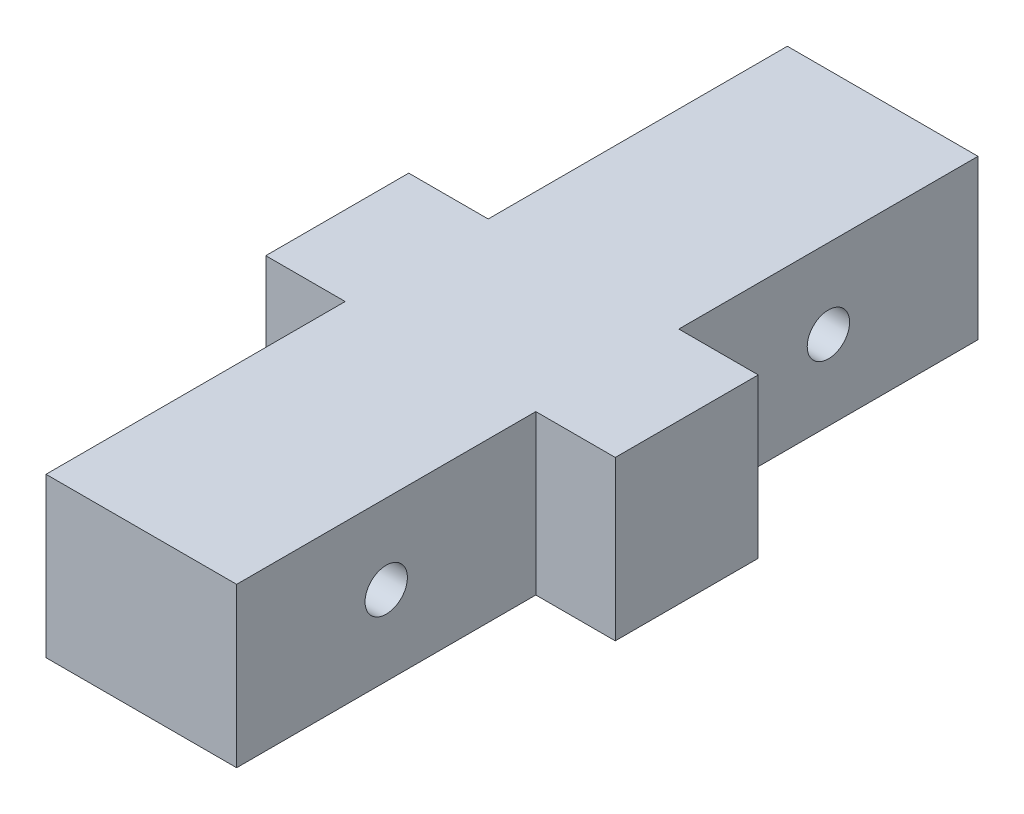
ISO-10303-21;
HEADER;
FILE_DESCRIPTION(('STEP AP214'),'2;1');
FILE_NAME('part.step','',(''),(''),'','','');
FILE_SCHEMA(('AUTOMOTIVE_DESIGN { 1 0 10303 214 1 1 1 1 }'));
ENDSEC;
DATA;
#1=APPLICATION_CONTEXT('core data for automotive mechanical design processes');
#2=APPLICATION_PROTOCOL_DEFINITION('international standard','automotive_design',2000,#1);
#3=PRODUCT_CONTEXT('',#1,'mechanical');
#4=PRODUCT('Part','Part','',(#3));
#5=PRODUCT_RELATED_PRODUCT_CATEGORY('part','',(#4));
#6=PRODUCT_DEFINITION_FORMATION('','',#4);
#7=PRODUCT_DEFINITION_CONTEXT('part definition',#1,'design');
#8=PRODUCT_DEFINITION('design','',#6,#7);
#9=PRODUCT_DEFINITION_SHAPE('','',#8);
#10=(LENGTH_UNIT() NAMED_UNIT(*) SI_UNIT(.MILLI.,.METRE.));
#11=(NAMED_UNIT(*) PLANE_ANGLE_UNIT() SI_UNIT($,.RADIAN.));
#12=(NAMED_UNIT(*) SI_UNIT($,.STERADIAN.) SOLID_ANGLE_UNIT());
#13=UNCERTAINTY_MEASURE_WITH_UNIT(LENGTH_MEASURE(1.E-05),#10,'distance_accuracy_value','');
#14=(GEOMETRIC_REPRESENTATION_CONTEXT(3) GLOBAL_UNCERTAINTY_ASSIGNED_CONTEXT((#13)) GLOBAL_UNIT_ASSIGNED_CONTEXT((#10,
#11,#12)) REPRESENTATION_CONTEXT('',''));
#15=CARTESIAN_POINT('',(0.,0.,0.));
#16=DIRECTION('',(0.,0.,1.));
#17=DIRECTION('',(1.,0.,0.));
#18=AXIS2_PLACEMENT_3D('',#15,#16,#17);
#19=CARTESIAN_POINT('',(-66.,60.,-27.));
#20=DIRECTION('',(1.,0.,0.));
#21=DIRECTION('',(0.,0.,-1.));
#22=AXIS2_PLACEMENT_3D('',#19,#20,#21);
#23=PLANE('',#22);
#24=DIRECTION('',(0.,0.,1.));
#25=VECTOR('',#24,1.);
#26=CARTESIAN_POINT('',(-66.,0.,-27.));
#27=LINE('',#26,#25);
#28=CARTESIAN_POINT('',(-66.,0.,-27.));
#29=VERTEX_POINT('',#28);
#30=CARTESIAN_POINT('',(-65.9999999999999,0.,27.));
#31=VERTEX_POINT('',#30);
#32=EDGE_CURVE('E156',#29,#31,#27,.T.);
#33=ORIENTED_EDGE('',*,*,#32,.T.);
#34=DIRECTION('',(0.,-1.,0.));
#35=VECTOR('',#34,1.);
#36=CARTESIAN_POINT('',(-65.9999999999999,60.,27.));
#37=LINE('',#36,#35);
#38=CARTESIAN_POINT('',(-65.9999999999999,60.,27.));
#39=VERTEX_POINT('',#38);
#40=EDGE_CURVE('E11',#39,#31,#37,.T.);
#41=ORIENTED_EDGE('',*,*,#40,.F.);
#42=DIRECTION('',(0.,0.,1.));
#43=VECTOR('',#42,1.);
#44=CARTESIAN_POINT('',(-66.,60.,-27.));
#45=LINE('',#44,#43);
#46=CARTESIAN_POINT('',(-66.,60.,-27.));
#47=VERTEX_POINT('',#46);
#48=EDGE_CURVE('E179',#47,#39,#45,.T.);
#49=ORIENTED_EDGE('',*,*,#48,.F.);
#50=DIRECTION('',(0.,-1.,0.));
#51=VECTOR('',#50,1.);
#52=CARTESIAN_POINT('',(-66.,60.,-27.));
#53=LINE('',#52,#51);
#54=EDGE_CURVE('E152',#47,#29,#53,.T.);
#55=ORIENTED_EDGE('',*,*,#54,.T.);
#56=EDGE_LOOP('',(#33,#41,#49,#55));
#57=FACE_BOUND('',#56,.T.);
#58=ADVANCED_FACE('F34',(#57),#23,.F.);
#59=CARTESIAN_POINT('',(-36.,60.,27.));
#60=DIRECTION('',(0.,0.,-1.));
#61=DIRECTION('',(-1.,0.,0.));
#62=AXIS2_PLACEMENT_3D('',#59,#60,#61);
#63=PLANE('',#62);
#64=DIRECTION('',(1.,0.,0.));
#65=VECTOR('',#64,1.);
#66=CARTESIAN_POINT('',(-36.,0.,27.));
#67=LINE('',#66,#65);
#68=CARTESIAN_POINT('',(-36.,0.,27.));
#69=VERTEX_POINT('',#68);
#70=EDGE_CURVE('E159',#31,#69,#67,.T.);
#71=ORIENTED_EDGE('',*,*,#70,.T.);
#72=DIRECTION('',(0.,-1.,0.));
#73=VECTOR('',#72,1.);
#74=CARTESIAN_POINT('',(-36.,60.,27.));
#75=LINE('',#74,#73);
#76=CARTESIAN_POINT('',(-36.,60.,27.));
#77=VERTEX_POINT('',#76);
#78=EDGE_CURVE('E43',#77,#69,#75,.T.);
#79=ORIENTED_EDGE('',*,*,#78,.F.);
#80=DIRECTION('',(1.,0.,0.));
#81=VECTOR('',#80,1.);
#82=CARTESIAN_POINT('',(-36.,60.,27.));
#83=LINE('',#82,#81);
#84=EDGE_CURVE('E107',#39,#77,#83,.T.);
#85=ORIENTED_EDGE('',*,*,#84,.F.);
#86=ORIENTED_EDGE('',*,*,#40,.T.);
#87=EDGE_LOOP('',(#71,#79,#85,#86));
#88=FACE_BOUND('',#87,.T.);
#89=ADVANCED_FACE('F256',(#88),#63,.F.);
#90=CARTESIAN_POINT('',(-35.9999999999999,60.,140.));
#91=DIRECTION('',(1.,0.,0.));
#92=DIRECTION('',(0.,0.,-1.));
#93=AXIS2_PLACEMENT_3D('',#90,#91,#92);
#94=PLANE('',#93);
#95=CARTESIAN_POINT('',(-35.9999999999999,30.,83.5));
#96=DIRECTION('',(1.,0.,0.));
#97=DIRECTION('',(0.,0.,-1.));
#98=AXIS2_PLACEMENT_3D('',#95,#96,#97);
#99=CIRCLE('',#98,8.00000000000001);
#100=CARTESIAN_POINT('',(-35.9999999999999,30.,75.5));
#101=VERTEX_POINT('',#100);
#102=EDGE_CURVE('E160',#101,#101,#99,.T.);
#103=ORIENTED_EDGE('',*,*,#102,.T.);
#104=EDGE_LOOP('',(#103));
#105=FACE_BOUND('',#104,.T.);
#106=DIRECTION('',(0.,0.,1.));
#107=VECTOR('',#106,1.);
#108=CARTESIAN_POINT('',(-35.9999999999999,0.,140.));
#109=LINE('',#108,#107);
#110=CARTESIAN_POINT('',(-35.9999999999999,0.,140.));
#111=VERTEX_POINT('',#110);
#112=EDGE_CURVE('E162',#69,#111,#109,.T.);
#113=ORIENTED_EDGE('',*,*,#112,.T.);
#114=DIRECTION('',(0.,-1.,0.));
#115=VECTOR('',#114,1.);
#116=CARTESIAN_POINT('',(-35.9999999999999,60.,140.));
#117=LINE('',#116,#115);
#118=CARTESIAN_POINT('',(-35.9999999999999,60.,140.));
#119=VERTEX_POINT('',#118);
#120=EDGE_CURVE('E198',#119,#111,#117,.T.);
#121=ORIENTED_EDGE('',*,*,#120,.F.);
#122=DIRECTION('',(0.,0.,1.));
#123=VECTOR('',#122,1.);
#124=CARTESIAN_POINT('',(-35.9999999999999,60.,140.));
#125=LINE('',#124,#123);
#126=EDGE_CURVE('E217',#77,#119,#125,.T.);
#127=ORIENTED_EDGE('',*,*,#126,.F.);
#128=ORIENTED_EDGE('',*,*,#78,.T.);
#129=EDGE_LOOP('',(#113,#121,#127,#128));
#130=FACE_BOUND('',#129,.T.);
#131=ADVANCED_FACE('F260',(#105,#130),#94,.F.);
#132=CARTESIAN_POINT('',(36.0000000000001,60.,140.));
#133=DIRECTION('',(0.,0.,-1.));
#134=DIRECTION('',(-1.,0.,0.));
#135=AXIS2_PLACEMENT_3D('',#132,#133,#134);
#136=PLANE('',#135);
#137=DIRECTION('',(1.,0.,0.));
#138=VECTOR('',#137,1.);
#139=CARTESIAN_POINT('',(36.0000000000001,0.,140.));
#140=LINE('',#139,#138);
#141=CARTESIAN_POINT('',(36.0000000000001,0.,140.));
#142=VERTEX_POINT('',#141);
#143=EDGE_CURVE('E164',#111,#142,#140,.T.);
#144=ORIENTED_EDGE('',*,*,#143,.T.);
#145=DIRECTION('',(0.,-1.,0.));
#146=VECTOR('',#145,1.);
#147=CARTESIAN_POINT('',(36.0000000000001,60.,140.));
#148=LINE('',#147,#146);
#149=CARTESIAN_POINT('',(36.0000000000001,60.,140.));
#150=VERTEX_POINT('',#149);
#151=EDGE_CURVE('E195',#150,#142,#148,.T.);
#152=ORIENTED_EDGE('',*,*,#151,.F.);
#153=DIRECTION('',(1.,0.,0.));
#154=VECTOR('',#153,1.);
#155=CARTESIAN_POINT('',(36.0000000000001,60.,140.));
#156=LINE('',#155,#154);
#157=EDGE_CURVE('E219',#119,#150,#156,.T.);
#158=ORIENTED_EDGE('',*,*,#157,.F.);
#159=ORIENTED_EDGE('',*,*,#120,.T.);
#160=EDGE_LOOP('',(#144,#152,#158,#159));
#161=FACE_BOUND('',#160,.T.);
#162=ADVANCED_FACE('F264',(#161),#136,.F.);
#163=CARTESIAN_POINT('',(36.,60.,27.));
#164=DIRECTION('',(-1.,0.,0.));
#165=DIRECTION('',(0.,0.,1.));
#166=AXIS2_PLACEMENT_3D('',#163,#164,#165);
#167=PLANE('',#166);
#168=CARTESIAN_POINT('',(36.,30.,83.5));
#169=DIRECTION('',(-1.,0.,0.));
#170=DIRECTION('',(0.,0.,1.));
#171=AXIS2_PLACEMENT_3D('',#168,#169,#170);
#172=CIRCLE('',#171,8.00000000000001);
#173=CARTESIAN_POINT('',(36.,30.,91.5000000000001));
#174=VERTEX_POINT('',#173);
#175=EDGE_CURVE('E37',#174,#174,#172,.T.);
#176=ORIENTED_EDGE('',*,*,#175,.T.);
#177=EDGE_LOOP('',(#176));
#178=FACE_BOUND('',#177,.T.);
#179=DIRECTION('',(0.,0.,-1.));
#180=VECTOR('',#179,1.);
#181=CARTESIAN_POINT('',(36.,0.,27.));
#182=LINE('',#181,#180);
#183=CARTESIAN_POINT('',(36.,0.,27.));
#184=VERTEX_POINT('',#183);
#185=EDGE_CURVE('E166',#142,#184,#182,.T.);
#186=ORIENTED_EDGE('',*,*,#185,.T.);
#187=DIRECTION('',(0.,-1.,0.));
#188=VECTOR('',#187,1.);
#189=CARTESIAN_POINT('',(36.,60.,27.));
#190=LINE('',#189,#188);
#191=CARTESIAN_POINT('',(36.,60.,27.));
#192=VERTEX_POINT('',#191);
#193=EDGE_CURVE('E192',#192,#184,#190,.T.);
#194=ORIENTED_EDGE('',*,*,#193,.F.);
#195=DIRECTION('',(0.,0.,-1.));
#196=VECTOR('',#195,1.);
#197=CARTESIAN_POINT('',(36.,60.,27.));
#198=LINE('',#197,#196);
#199=EDGE_CURVE('E221',#150,#192,#198,.T.);
#200=ORIENTED_EDGE('',*,*,#199,.F.);
#201=ORIENTED_EDGE('',*,*,#151,.T.);
#202=EDGE_LOOP('',(#186,#194,#200,#201));
#203=FACE_BOUND('',#202,.T.);
#204=ADVANCED_FACE('F270',(#178,#203),#167,.F.);
#205=CARTESIAN_POINT('',(66.0000000000001,60.,27.));
#206=DIRECTION('',(0.,0.,-1.));
#207=DIRECTION('',(-1.,0.,0.));
#208=AXIS2_PLACEMENT_3D('',#205,#206,#207);
#209=PLANE('',#208);
#210=DIRECTION('',(1.,0.,0.));
#211=VECTOR('',#210,1.);
#212=CARTESIAN_POINT('',(66.0000000000001,0.,27.));
#213=LINE('',#212,#211);
#214=CARTESIAN_POINT('',(66.0000000000001,0.,27.));
#215=VERTEX_POINT('',#214);
#216=EDGE_CURVE('E168',#184,#215,#213,.T.);
#217=ORIENTED_EDGE('',*,*,#216,.T.);
#218=DIRECTION('',(0.,-1.,0.));
#219=VECTOR('',#218,1.);
#220=CARTESIAN_POINT('',(66.0000000000001,60.,27.));
#221=LINE('',#220,#219);
#222=CARTESIAN_POINT('',(66.0000000000001,60.,27.));
#223=VERTEX_POINT('',#222);
#224=EDGE_CURVE('E189',#223,#215,#221,.T.);
#225=ORIENTED_EDGE('',*,*,#224,.F.);
#226=DIRECTION('',(1.,0.,0.));
#227=VECTOR('',#226,1.);
#228=CARTESIAN_POINT('',(66.0000000000001,60.,27.));
#229=LINE('',#228,#227);
#230=EDGE_CURVE('E223',#192,#223,#229,.T.);
#231=ORIENTED_EDGE('',*,*,#230,.F.);
#232=ORIENTED_EDGE('',*,*,#193,.T.);
#233=EDGE_LOOP('',(#217,#225,#231,#232));
#234=FACE_BOUND('',#233,.T.);
#235=ADVANCED_FACE('F274',(#234),#209,.F.);
#236=CARTESIAN_POINT('',(66.0000000000001,60.,-27.));
#237=DIRECTION('',(-1.,0.,0.));
#238=DIRECTION('',(0.,0.,1.));
#239=AXIS2_PLACEMENT_3D('',#236,#237,#238);
#240=PLANE('',#239);
#241=DIRECTION('',(0.,0.,-1.));
#242=VECTOR('',#241,1.);
#243=CARTESIAN_POINT('',(66.0000000000001,0.,-27.));
#244=LINE('',#243,#242);
#245=CARTESIAN_POINT('',(66.0000000000001,0.,-27.));
#246=VERTEX_POINT('',#245);
#247=EDGE_CURVE('E170',#215,#246,#244,.T.);
#248=ORIENTED_EDGE('',*,*,#247,.T.);
#249=DIRECTION('',(0.,-1.,0.));
#250=VECTOR('',#249,1.);
#251=CARTESIAN_POINT('',(66.0000000000001,60.,-27.));
#252=LINE('',#251,#250);
#253=CARTESIAN_POINT('',(66.0000000000001,60.,-27.));
#254=VERTEX_POINT('',#253);
#255=EDGE_CURVE('E186',#254,#246,#252,.T.);
#256=ORIENTED_EDGE('',*,*,#255,.F.);
#257=DIRECTION('',(0.,0.,-1.));
#258=VECTOR('',#257,1.);
#259=CARTESIAN_POINT('',(66.0000000000001,60.,-27.));
#260=LINE('',#259,#258);
#261=EDGE_CURVE('E225',#223,#254,#260,.T.);
#262=ORIENTED_EDGE('',*,*,#261,.F.);
#263=ORIENTED_EDGE('',*,*,#224,.T.);
#264=EDGE_LOOP('',(#248,#256,#262,#263));
#265=FACE_BOUND('',#264,.T.);
#266=ADVANCED_FACE('F278',(#265),#240,.F.);
#267=CARTESIAN_POINT('',(36.,60.,-27.));
#268=DIRECTION('',(0.,0.,1.));
#269=DIRECTION('',(1.,0.,0.));
#270=AXIS2_PLACEMENT_3D('',#267,#268,#269);
#271=PLANE('',#270);
#272=DIRECTION('',(-1.,0.,0.));
#273=VECTOR('',#272,1.);
#274=CARTESIAN_POINT('',(36.,0.,-27.));
#275=LINE('',#274,#273);
#276=CARTESIAN_POINT('',(36.,0.,-27.));
#277=VERTEX_POINT('',#276);
#278=EDGE_CURVE('E172',#246,#277,#275,.T.);
#279=ORIENTED_EDGE('',*,*,#278,.T.);
#280=DIRECTION('',(0.,-1.,0.));
#281=VECTOR('',#280,1.);
#282=CARTESIAN_POINT('',(36.,60.,-27.));
#283=LINE('',#282,#281);
#284=CARTESIAN_POINT('',(36.,60.,-27.));
#285=VERTEX_POINT('',#284);
#286=EDGE_CURVE('E183',#285,#277,#283,.T.);
#287=ORIENTED_EDGE('',*,*,#286,.F.);
#288=DIRECTION('',(-1.,0.,0.));
#289=VECTOR('',#288,1.);
#290=CARTESIAN_POINT('',(36.,60.,-27.));
#291=LINE('',#290,#289);
#292=EDGE_CURVE('E227',#254,#285,#291,.T.);
#293=ORIENTED_EDGE('',*,*,#292,.F.);
#294=ORIENTED_EDGE('',*,*,#255,.T.);
#295=EDGE_LOOP('',(#279,#287,#293,#294));
#296=FACE_BOUND('',#295,.T.);
#297=ADVANCED_FACE('F233',(#296),#271,.F.);
#298=CARTESIAN_POINT('',(36.,60.,-140.));
#299=DIRECTION('',(-1.,0.,0.));
#300=DIRECTION('',(0.,0.,1.));
#301=AXIS2_PLACEMENT_3D('',#298,#299,#300);
#302=PLANE('',#301);
#303=CARTESIAN_POINT('',(36.,30.,-83.4999999999999));
#304=DIRECTION('',(-1.,0.,0.));
#305=DIRECTION('',(0.,0.,1.));
#306=AXIS2_PLACEMENT_3D('',#303,#304,#305);
#307=CIRCLE('',#306,8.00000000000001);
#308=CARTESIAN_POINT('',(36.,30.,-75.4999999999999));
#309=VERTEX_POINT('',#308);
#310=EDGE_CURVE('E204',#309,#309,#307,.T.);
#311=ORIENTED_EDGE('',*,*,#310,.T.);
#312=EDGE_LOOP('',(#311));
#313=FACE_BOUND('',#312,.T.);
#314=DIRECTION('',(0.,0.,-1.));
#315=VECTOR('',#314,1.);
#316=CARTESIAN_POINT('',(36.,0.,-140.));
#317=LINE('',#316,#315);
#318=CARTESIAN_POINT('',(36.,0.,-140.));
#319=VERTEX_POINT('',#318);
#320=EDGE_CURVE('E174',#277,#319,#317,.T.);
#321=ORIENTED_EDGE('',*,*,#320,.T.);
#322=DIRECTION('',(0.,-1.,0.));
#323=VECTOR('',#322,1.);
#324=CARTESIAN_POINT('',(36.,60.,-140.));
#325=LINE('',#324,#323);
#326=CARTESIAN_POINT('',(36.,60.,-140.));
#327=VERTEX_POINT('',#326);
#328=EDGE_CURVE('E147',#327,#319,#325,.T.);
#329=ORIENTED_EDGE('',*,*,#328,.F.);
#330=DIRECTION('',(0.,0.,-1.));
#331=VECTOR('',#330,1.);
#332=CARTESIAN_POINT('',(36.,60.,-140.));
#333=LINE('',#332,#331);
#334=EDGE_CURVE('E138',#285,#327,#333,.T.);
#335=ORIENTED_EDGE('',*,*,#334,.F.);
#336=ORIENTED_EDGE('',*,*,#286,.T.);
#337=EDGE_LOOP('',(#321,#329,#335,#336));
#338=FACE_BOUND('',#337,.T.);
#339=ADVANCED_FACE('F237',(#313,#338),#302,.F.);
#340=CARTESIAN_POINT('',(-36.,60.,-140.));
#341=DIRECTION('',(0.,0.,1.));
#342=DIRECTION('',(1.,0.,0.));
#343=AXIS2_PLACEMENT_3D('',#340,#341,#342);
#344=PLANE('',#343);
#345=DIRECTION('',(-1.,0.,0.));
#346=VECTOR('',#345,1.);
#347=CARTESIAN_POINT('',(-36.,0.,-140.));
#348=LINE('',#347,#346);
#349=CARTESIAN_POINT('',(-36.,0.,-140.));
#350=VERTEX_POINT('',#349);
#351=EDGE_CURVE('E146',#319,#350,#348,.T.);
#352=ORIENTED_EDGE('',*,*,#351,.T.);
#353=DIRECTION('',(0.,-1.,0.));
#354=VECTOR('',#353,1.);
#355=CARTESIAN_POINT('',(-36.,60.,-140.));
#356=LINE('',#355,#354);
#357=CARTESIAN_POINT('',(-36.,60.,-140.));
#358=VERTEX_POINT('',#357);
#359=EDGE_CURVE('E143',#358,#350,#356,.T.);
#360=ORIENTED_EDGE('',*,*,#359,.F.);
#361=DIRECTION('',(-1.,0.,0.));
#362=VECTOR('',#361,1.);
#363=CARTESIAN_POINT('',(-36.,60.,-140.));
#364=LINE('',#363,#362);
#365=EDGE_CURVE('E132',#327,#358,#364,.T.);
#366=ORIENTED_EDGE('',*,*,#365,.F.);
#367=ORIENTED_EDGE('',*,*,#328,.T.);
#368=EDGE_LOOP('',(#352,#360,#366,#367));
#369=FACE_BOUND('',#368,.T.);
#370=ADVANCED_FACE('F144',(#369),#344,.F.);
#371=CARTESIAN_POINT('',(-36.,60.,-27.));
#372=DIRECTION('',(1.,0.,0.));
#373=DIRECTION('',(0.,0.,-1.));
#374=AXIS2_PLACEMENT_3D('',#371,#372,#373);
#375=PLANE('',#374);
#376=CARTESIAN_POINT('',(-36.,30.,-83.4999999999999));
#377=DIRECTION('',(1.,0.,0.));
#378=DIRECTION('',(0.,0.,-1.));
#379=AXIS2_PLACEMENT_3D('',#376,#377,#378);
#380=CIRCLE('',#379,8.00000000000001);
#381=CARTESIAN_POINT('',(-36.,30.,-91.4999999999999));
#382=VERTEX_POINT('',#381);
#383=EDGE_CURVE('E202',#382,#382,#380,.T.);
#384=ORIENTED_EDGE('',*,*,#383,.T.);
#385=EDGE_LOOP('',(#384));
#386=FACE_BOUND('',#385,.T.);
#387=DIRECTION('',(0.,0.,1.));
#388=VECTOR('',#387,1.);
#389=CARTESIAN_POINT('',(-36.,0.,-27.));
#390=LINE('',#389,#388);
#391=CARTESIAN_POINT('',(-36.,0.,-27.));
#392=VERTEX_POINT('',#391);
#393=EDGE_CURVE('E93',#350,#392,#390,.T.);
#394=ORIENTED_EDGE('',*,*,#393,.T.);
#395=DIRECTION('',(0.,-1.,0.));
#396=VECTOR('',#395,1.);
#397=CARTESIAN_POINT('',(-36.,60.,-27.));
#398=LINE('',#397,#396);
#399=CARTESIAN_POINT('',(-36.,60.,-27.));
#400=VERTEX_POINT('',#399);
#401=EDGE_CURVE('E148',#400,#392,#398,.T.);
#402=ORIENTED_EDGE('',*,*,#401,.F.);
#403=DIRECTION('',(0.,0.,1.));
#404=VECTOR('',#403,1.);
#405=CARTESIAN_POINT('',(-36.,60.,-27.));
#406=LINE('',#405,#404);
#407=EDGE_CURVE('E136',#358,#400,#406,.T.);
#408=ORIENTED_EDGE('',*,*,#407,.F.);
#409=ORIENTED_EDGE('',*,*,#359,.T.);
#410=EDGE_LOOP('',(#394,#402,#408,#409));
#411=FACE_BOUND('',#410,.T.);
#412=ADVANCED_FACE('F150',(#386,#411),#375,.F.);
#413=CARTESIAN_POINT('',(-66.,60.,-27.));
#414=DIRECTION('',(0.,0.,1.));
#415=DIRECTION('',(1.,0.,0.));
#416=AXIS2_PLACEMENT_3D('',#413,#414,#415);
#417=PLANE('',#416);
#418=DIRECTION('',(-1.,0.,0.));
#419=VECTOR('',#418,1.);
#420=CARTESIAN_POINT('',(-66.,0.,-27.));
#421=LINE('',#420,#419);
#422=EDGE_CURVE('E99',#392,#29,#421,.T.);
#423=ORIENTED_EDGE('',*,*,#422,.T.);
#424=ORIENTED_EDGE('',*,*,#54,.F.);
#425=DIRECTION('',(-1.,0.,0.));
#426=VECTOR('',#425,1.);
#427=CARTESIAN_POINT('',(-66.,60.,-27.));
#428=LINE('',#427,#426);
#429=EDGE_CURVE('E52',#400,#47,#428,.T.);
#430=ORIENTED_EDGE('',*,*,#429,.F.);
#431=ORIENTED_EDGE('',*,*,#401,.T.);
#432=EDGE_LOOP('',(#423,#424,#430,#431));
#433=FACE_BOUND('',#432,.T.);
#434=ADVANCED_FACE('F245',(#433),#417,.F.);
#435=CARTESIAN_POINT('',(0.,60.,0.));
#436=DIRECTION('',(0.,-1.,0.));
#437=DIRECTION('',(0.,0.,-1.));
#438=AXIS2_PLACEMENT_3D('',#435,#436,#437);
#439=PLANE('',#438);
#440=ORIENTED_EDGE('',*,*,#48,.T.);
#441=ORIENTED_EDGE('',*,*,#84,.T.);
#442=ORIENTED_EDGE('',*,*,#126,.T.);
#443=ORIENTED_EDGE('',*,*,#157,.T.);
#444=ORIENTED_EDGE('',*,*,#199,.T.);
#445=ORIENTED_EDGE('',*,*,#230,.T.);
#446=ORIENTED_EDGE('',*,*,#261,.T.);
#447=ORIENTED_EDGE('',*,*,#292,.T.);
#448=ORIENTED_EDGE('',*,*,#334,.T.);
#449=ORIENTED_EDGE('',*,*,#365,.T.);
#450=ORIENTED_EDGE('',*,*,#407,.T.);
#451=ORIENTED_EDGE('',*,*,#429,.T.);
#452=EDGE_LOOP('',(#440,#441,#442,#443,#444,#445,#446,#447,#448,#449,#450,#451));
#453=FACE_BOUND('',#452,.T.);
#454=ADVANCED_FACE('F134',(#453),#439,.F.);
#455=CARTESIAN_POINT('',(0.,0.,0.));
#456=DIRECTION('',(0.,-1.,0.));
#457=DIRECTION('',(0.,0.,-1.));
#458=AXIS2_PLACEMENT_3D('',#455,#456,#457);
#459=PLANE('',#458);
#460=ORIENTED_EDGE('',*,*,#32,.F.);
#461=ORIENTED_EDGE('',*,*,#422,.F.);
#462=ORIENTED_EDGE('',*,*,#393,.F.);
#463=ORIENTED_EDGE('',*,*,#351,.F.);
#464=ORIENTED_EDGE('',*,*,#320,.F.);
#465=ORIENTED_EDGE('',*,*,#278,.F.);
#466=ORIENTED_EDGE('',*,*,#247,.F.);
#467=ORIENTED_EDGE('',*,*,#216,.F.);
#468=ORIENTED_EDGE('',*,*,#185,.F.);
#469=ORIENTED_EDGE('',*,*,#143,.F.);
#470=ORIENTED_EDGE('',*,*,#112,.F.);
#471=ORIENTED_EDGE('',*,*,#70,.F.);
#472=EDGE_LOOP('',(#460,#461,#462,#463,#464,#465,#466,#467,#468,#469,#470,#471));
#473=FACE_BOUND('',#472,.T.);
#474=ADVANCED_FACE('F240',(#473),#459,.T.);
#475=CARTESIAN_POINT('',(66.0000000000001,30.,-83.4999999999999));
#476=DIRECTION('',(-1.,0.,0.));
#477=DIRECTION('',(0.,0.,1.));
#478=AXIS2_PLACEMENT_3D('',#475,#476,#477);
#479=CYLINDRICAL_SURFACE('',#478,8.00000000000001);
#480=ORIENTED_EDGE('',*,*,#383,.F.);
#481=EDGE_LOOP('',(#480));
#482=FACE_BOUND('',#481,.T.);
#483=ORIENTED_EDGE('',*,*,#310,.F.);
#484=EDGE_LOOP('',(#483));
#485=FACE_BOUND('',#484,.T.);
#486=ADVANCED_FACE('F306',(#482,#485),#479,.F.);
#487=CARTESIAN_POINT('',(66.0000000000001,30.,83.5));
#488=DIRECTION('',(-1.,0.,0.));
#489=DIRECTION('',(0.,0.,1.));
#490=AXIS2_PLACEMENT_3D('',#487,#488,#489);
#491=CYLINDRICAL_SURFACE('',#490,8.00000000000001);
#492=ORIENTED_EDGE('',*,*,#175,.F.);
#493=EDGE_LOOP('',(#492));
#494=FACE_BOUND('',#493,.T.);
#495=ORIENTED_EDGE('',*,*,#102,.F.);
#496=EDGE_LOOP('',(#495));
#497=FACE_BOUND('',#496,.T.);
#498=ADVANCED_FACE('F311',(#494,#497),#491,.F.);
#499=CLOSED_SHELL('',(#58,#89,#131,#162,#204,#235,#266,#297,#339,#370,#412,#434,#454,#474,#486,#498));
#500=MANIFOLD_SOLID_BREP('B2',#499);
#501=ADVANCED_BREP_SHAPE_REPRESENTATION('',(#18,#500),#14);
#502=SHAPE_DEFINITION_REPRESENTATION(#9,#501);
ENDSEC;
END-ISO-10303-21;
